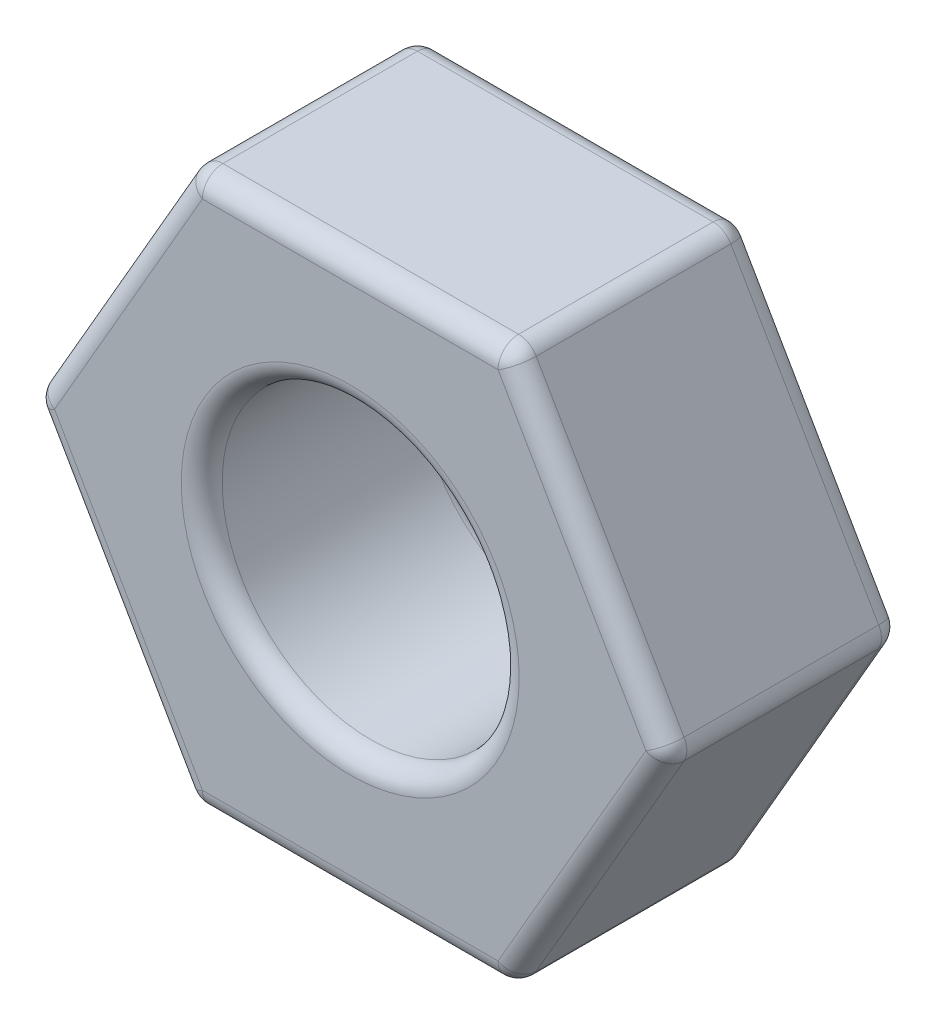
ISO-10303-21;
HEADER;
FILE_DESCRIPTION(('STEP AP214'),'2;1');
FILE_NAME('part.step','',(''),(''),'','','');
FILE_SCHEMA(('AUTOMOTIVE_DESIGN { 1 0 10303 214 1 1 1 1 }'));
ENDSEC;
DATA;
#1=APPLICATION_CONTEXT('core data for automotive mechanical design processes');
#2=APPLICATION_PROTOCOL_DEFINITION('international standard','automotive_design',2000,#1);
#3=PRODUCT_CONTEXT('',#1,'mechanical');
#4=PRODUCT('Part','Part','',(#3));
#5=PRODUCT_RELATED_PRODUCT_CATEGORY('part','',(#4));
#6=PRODUCT_DEFINITION_FORMATION('','',#4);
#7=PRODUCT_DEFINITION_CONTEXT('part definition',#1,'design');
#8=PRODUCT_DEFINITION('design','',#6,#7);
#9=PRODUCT_DEFINITION_SHAPE('','',#8);
#10=(LENGTH_UNIT() NAMED_UNIT(*) SI_UNIT(.MILLI.,.METRE.));
#11=(NAMED_UNIT(*) PLANE_ANGLE_UNIT() SI_UNIT($,.RADIAN.));
#12=(NAMED_UNIT(*) SI_UNIT($,.STERADIAN.) SOLID_ANGLE_UNIT());
#13=UNCERTAINTY_MEASURE_WITH_UNIT(LENGTH_MEASURE(1.E-05),#10,'distance_accuracy_value','');
#14=(GEOMETRIC_REPRESENTATION_CONTEXT(3) GLOBAL_UNCERTAINTY_ASSIGNED_CONTEXT((#13)) GLOBAL_UNIT_ASSIGNED_CONTEXT((#10,
#11,#12)) REPRESENTATION_CONTEXT('',''));
#15=CARTESIAN_POINT('',(0.,0.,0.));
#16=DIRECTION('',(0.,0.,1.));
#17=DIRECTION('',(1.,0.,0.));
#18=AXIS2_PLACEMENT_3D('',#15,#16,#17);
#19=CARTESIAN_POINT('',(0.,0.,2.3));
#20=DIRECTION('',(0.,0.,1.));
#21=DIRECTION('',(1.,0.,0.));
#22=AXIS2_PLACEMENT_3D('',#19,#20,#21);
#23=PLANE('',#22);
#24=CARTESIAN_POINT('',(0.,0.,2.3));
#25=DIRECTION('',(0.,0.,1.));
#26=DIRECTION('',(1.,0.,0.));
#27=AXIS2_PLACEMENT_3D('',#24,#25,#26);
#28=CIRCLE('',#27,1.65);
#29=CARTESIAN_POINT('',(1.65,0.,2.3));
#30=VERTEX_POINT('',#29);
#31=EDGE_CURVE('E11',#30,#30,#28,.F.);
#32=ORIENTED_EDGE('',*,*,#31,.T.);
#33=EDGE_LOOP('',(#32));
#34=FACE_BOUND('',#33,.T.);
#35=DIRECTION('',(-0.5,0.866025403784439,0.));
#36=VECTOR('',#35,1.);
#37=CARTESIAN_POINT('',(1.3856406460551,2.6,2.3));
#38=LINE('',#37,#36);
#39=CARTESIAN_POINT('',(2.88675134594813,0.,2.3));
#40=VERTEX_POINT('',#39);
#41=CARTESIAN_POINT('',(1.44337567297406,2.5,2.3));
#42=VERTEX_POINT('',#41);
#43=EDGE_CURVE('E60',#40,#42,#38,.T.);
#44=ORIENTED_EDGE('',*,*,#43,.T.);
#45=DIRECTION('',(-1.,0.,0.));
#46=VECTOR('',#45,1.);
#47=CARTESIAN_POINT('',(-1.55884572681199,2.5,2.3));
#48=LINE('',#47,#46);
#49=CARTESIAN_POINT('',(-1.44337567297406,2.5,2.3));
#50=VERTEX_POINT('',#49);
#51=EDGE_CURVE('E52',#42,#50,#48,.T.);
#52=ORIENTED_EDGE('',*,*,#51,.T.);
#53=DIRECTION('',(-0.5,-0.866025403784439,0.));
#54=VECTOR('',#53,1.);
#55=CARTESIAN_POINT('',(-2.94448637286709,-0.0999999999999998,2.3));
#56=LINE('',#55,#54);
#57=CARTESIAN_POINT('',(-2.88675134594813,0.,2.3));
#58=VERTEX_POINT('',#57);
#59=EDGE_CURVE('E278',#50,#58,#56,.T.);
#60=ORIENTED_EDGE('',*,*,#59,.T.);
#61=DIRECTION('',(0.5,-0.866025403784439,0.));
#62=VECTOR('',#61,1.);
#63=CARTESIAN_POINT('',(-1.3856406460551,-2.6,2.3));
#64=LINE('',#63,#62);
#65=CARTESIAN_POINT('',(-1.44337567297407,-2.5,2.3));
#66=VERTEX_POINT('',#65);
#67=EDGE_CURVE('E280',#58,#66,#64,.T.);
#68=ORIENTED_EDGE('',*,*,#67,.T.);
#69=DIRECTION('',(1.,0.,0.));
#70=VECTOR('',#69,1.);
#71=CARTESIAN_POINT('',(1.55884572681199,-2.5,2.3));
#72=LINE('',#71,#70);
#73=CARTESIAN_POINT('',(1.44337567297406,-2.5,2.3));
#74=VERTEX_POINT('',#73);
#75=EDGE_CURVE('E282',#66,#74,#72,.T.);
#76=ORIENTED_EDGE('',*,*,#75,.T.);
#77=DIRECTION('',(0.5,0.866025403784439,0.));
#78=VECTOR('',#77,1.);
#79=CARTESIAN_POINT('',(2.94448637286709,0.1,2.3));
#80=LINE('',#79,#78);
#81=EDGE_CURVE('E65',#74,#40,#80,.T.);
#82=ORIENTED_EDGE('',*,*,#81,.T.);
#83=EDGE_LOOP('',(#44,#52,#60,#68,#76,#82));
#84=FACE_BOUND('',#83,.T.);
#85=ADVANCED_FACE('F43',(#34,#84),#23,.T.);
#86=CARTESIAN_POINT('',(0.,0.,0.));
#87=DIRECTION('',(0.,0.,1.));
#88=DIRECTION('',(1.,0.,0.));
#89=AXIS2_PLACEMENT_3D('',#86,#87,#88);
#90=PLANE('',#89);
#91=CARTESIAN_POINT('',(0.,0.,0.));
#92=DIRECTION('',(0.,0.,1.));
#93=DIRECTION('',(1.,0.,0.));
#94=AXIS2_PLACEMENT_3D('',#91,#92,#93);
#95=CIRCLE('',#94,1.65);
#96=CARTESIAN_POINT('',(1.65,0.,0.));
#97=VERTEX_POINT('',#96);
#98=EDGE_CURVE('E269',#97,#97,#95,.T.);
#99=ORIENTED_EDGE('',*,*,#98,.T.);
#100=EDGE_LOOP('',(#99));
#101=FACE_BOUND('',#100,.T.);
#102=DIRECTION('',(1.,0.,0.));
#103=VECTOR('',#102,1.);
#104=CARTESIAN_POINT('',(0.,-2.5,0.));
#105=LINE('',#104,#103);
#106=CARTESIAN_POINT('',(1.44337567297406,-2.5,0.));
#107=VERTEX_POINT('',#106);
#108=CARTESIAN_POINT('',(-1.44337567297407,-2.5,0.));
#109=VERTEX_POINT('',#108);
#110=EDGE_CURVE('E264',#107,#109,#105,.F.);
#111=ORIENTED_EDGE('',*,*,#110,.T.);
#112=DIRECTION('',(0.5,-0.866025403784439,0.));
#113=VECTOR('',#112,1.);
#114=CARTESIAN_POINT('',(-2.1650635094611,-1.25,0.));
#115=LINE('',#114,#113);
#116=CARTESIAN_POINT('',(-2.88675134594813,0.,0.));
#117=VERTEX_POINT('',#116);
#118=EDGE_CURVE('E266',#109,#117,#115,.F.);
#119=ORIENTED_EDGE('',*,*,#118,.T.);
#120=DIRECTION('',(-0.5,-0.866025403784439,0.));
#121=VECTOR('',#120,1.);
#122=CARTESIAN_POINT('',(-2.1650635094611,1.25,0.));
#123=LINE('',#122,#121);
#124=CARTESIAN_POINT('',(-1.44337567297406,2.5,0.));
#125=VERTEX_POINT('',#124);
#126=EDGE_CURVE('E256',#117,#125,#123,.F.);
#127=ORIENTED_EDGE('',*,*,#126,.T.);
#128=DIRECTION('',(-1.,0.,0.));
#129=VECTOR('',#128,1.);
#130=CARTESIAN_POINT('',(0.,2.5,0.));
#131=LINE('',#130,#129);
#132=CARTESIAN_POINT('',(1.44337567297406,2.5,0.));
#133=VERTEX_POINT('',#132);
#134=EDGE_CURVE('E258',#125,#133,#131,.F.);
#135=ORIENTED_EDGE('',*,*,#134,.T.);
#136=DIRECTION('',(-0.5,0.866025403784439,0.));
#137=VECTOR('',#136,1.);
#138=CARTESIAN_POINT('',(2.1650635094611,1.25,0.));
#139=LINE('',#138,#137);
#140=CARTESIAN_POINT('',(2.88675134594813,0.,0.));
#141=VERTEX_POINT('',#140);
#142=EDGE_CURVE('E260',#133,#141,#139,.F.);
#143=ORIENTED_EDGE('',*,*,#142,.T.);
#144=DIRECTION('',(0.5,0.866025403784439,0.));
#145=VECTOR('',#144,1.);
#146=CARTESIAN_POINT('',(2.1650635094611,-1.25,0.));
#147=LINE('',#146,#145);
#148=EDGE_CURVE('E262',#141,#107,#147,.F.);
#149=ORIENTED_EDGE('',*,*,#148,.T.);
#150=EDGE_LOOP('',(#111,#119,#127,#135,#143,#149));
#151=FACE_BOUND('',#150,.T.);
#152=ADVANCED_FACE('F386',(#101,#151),#90,.F.);
#153=CARTESIAN_POINT('',(-1.55884572681199,2.7,2.3));
#154=DIRECTION('',(0.866025403784439,-0.5,0.));
#155=DIRECTION('',(0.5,0.866025403784439,0.));
#156=AXIS2_PLACEMENT_3D('',#153,#154,#155);
#157=PLANE('',#156);
#158=DIRECTION('',(0.,0.,-1.));
#159=VECTOR('',#158,1.);
#160=CARTESIAN_POINT('',(-1.61658075373095,2.6,2.3));
#161=LINE('',#160,#159);
#162=CARTESIAN_POINT('',(-1.61658075373095,2.6,2.1));
#163=VERTEX_POINT('',#162);
#164=CARTESIAN_POINT('',(-1.61658075373095,2.6,0.2));
#165=VERTEX_POINT('',#164);
#166=EDGE_CURVE('E226',#163,#165,#161,.T.);
#167=ORIENTED_EDGE('',*,*,#166,.T.);
#168=DIRECTION('',(-0.5,-0.866025403784439,0.));
#169=VECTOR('',#168,1.);
#170=CARTESIAN_POINT('',(-1.55884572681199,2.7,0.2));
#171=LINE('',#170,#169);
#172=CARTESIAN_POINT('',(-3.05995642670502,0.1,0.2));
#173=VERTEX_POINT('',#172);
#174=EDGE_CURVE('E229',#165,#173,#171,.T.);
#175=ORIENTED_EDGE('',*,*,#174,.T.);
#176=DIRECTION('',(0.,0.,-1.));
#177=VECTOR('',#176,1.);
#178=CARTESIAN_POINT('',(-3.05995642670502,0.1,2.3));
#179=LINE('',#178,#177);
#180=CARTESIAN_POINT('',(-3.05995642670502,0.1,2.1));
#181=VERTEX_POINT('',#180);
#182=EDGE_CURVE('E224',#173,#181,#179,.F.);
#183=ORIENTED_EDGE('',*,*,#182,.T.);
#184=DIRECTION('',(-0.5,-0.866025403784439,0.));
#185=VECTOR('',#184,1.);
#186=CARTESIAN_POINT('',(-1.55884572681199,2.7,2.1));
#187=LINE('',#186,#185);
#188=EDGE_CURVE('E222',#181,#163,#187,.F.);
#189=ORIENTED_EDGE('',*,*,#188,.T.);
#190=EDGE_LOOP('',(#167,#175,#183,#189));
#191=FACE_BOUND('',#190,.T.);
#192=ADVANCED_FACE('F472',(#191),#157,.F.);
#193=CARTESIAN_POINT('',(-3.11769145362398,0.,2.3));
#194=DIRECTION('',(0.866025403784439,0.5,0.));
#195=DIRECTION('',(-0.5,0.866025403784439,0.));
#196=AXIS2_PLACEMENT_3D('',#193,#194,#195);
#197=PLANE('',#196);
#198=DIRECTION('',(0.,0.,-1.));
#199=VECTOR('',#198,1.);
#200=CARTESIAN_POINT('',(-3.05995642670502,-0.0999999999999998,2.3));
#201=LINE('',#200,#199);
#202=CARTESIAN_POINT('',(-3.05995642670502,-0.0999999999999997,2.1));
#203=VERTEX_POINT('',#202);
#204=CARTESIAN_POINT('',(-3.05995642670502,-0.0999999999999998,0.2));
#205=VERTEX_POINT('',#204);
#206=EDGE_CURVE('E215',#203,#205,#201,.T.);
#207=ORIENTED_EDGE('',*,*,#206,.T.);
#208=DIRECTION('',(0.5,-0.866025403784439,0.));
#209=VECTOR('',#208,1.);
#210=CARTESIAN_POINT('',(-3.11769145362398,0.,0.2));
#211=LINE('',#210,#209);
#212=CARTESIAN_POINT('',(-1.61658075373095,-2.6,0.2));
#213=VERTEX_POINT('',#212);
#214=EDGE_CURVE('E220',#205,#213,#211,.T.);
#215=ORIENTED_EDGE('',*,*,#214,.T.);
#216=DIRECTION('',(0.,0.,-1.));
#217=VECTOR('',#216,1.);
#218=CARTESIAN_POINT('',(-1.61658075373095,-2.6,2.3));
#219=LINE('',#218,#217);
#220=CARTESIAN_POINT('',(-1.61658075373095,-2.6,2.1));
#221=VERTEX_POINT('',#220);
#222=EDGE_CURVE('E217',#213,#221,#219,.F.);
#223=ORIENTED_EDGE('',*,*,#222,.T.);
#224=DIRECTION('',(0.5,-0.866025403784439,0.));
#225=VECTOR('',#224,1.);
#226=CARTESIAN_POINT('',(-3.11769145362398,0.,2.1));
#227=LINE('',#226,#225);
#228=EDGE_CURVE('E213',#221,#203,#227,.F.);
#229=ORIENTED_EDGE('',*,*,#228,.T.);
#230=EDGE_LOOP('',(#207,#215,#223,#229));
#231=FACE_BOUND('',#230,.T.);
#232=ADVANCED_FACE('F488',(#231),#197,.F.);
#233=CARTESIAN_POINT('',(-1.55884572681199,-2.7,2.3));
#234=DIRECTION('',(0.,1.,0.));
#235=DIRECTION('',(-1.,0.,0.));
#236=AXIS2_PLACEMENT_3D('',#233,#234,#235);
#237=PLANE('',#236);
#238=DIRECTION('',(0.,0.,-1.));
#239=VECTOR('',#238,1.);
#240=CARTESIAN_POINT('',(-1.44337567297407,-2.7,2.3));
#241=LINE('',#240,#239);
#242=CARTESIAN_POINT('',(-1.44337567297407,-2.7,2.1));
#243=VERTEX_POINT('',#242);
#244=CARTESIAN_POINT('',(-1.44337567297407,-2.7,0.2));
#245=VERTEX_POINT('',#244);
#246=EDGE_CURVE('E180',#243,#245,#241,.T.);
#247=ORIENTED_EDGE('',*,*,#246,.T.);
#248=DIRECTION('',(1.,0.,0.));
#249=VECTOR('',#248,1.);
#250=CARTESIAN_POINT('',(-1.55884572681199,-2.7,0.2));
#251=LINE('',#250,#249);
#252=CARTESIAN_POINT('',(1.44337567297406,-2.7,0.2));
#253=VERTEX_POINT('',#252);
#254=EDGE_CURVE('E176',#245,#253,#251,.T.);
#255=ORIENTED_EDGE('',*,*,#254,.T.);
#256=DIRECTION('',(0.,0.,-1.));
#257=VECTOR('',#256,1.);
#258=CARTESIAN_POINT('',(1.44337567297406,-2.7,2.3));
#259=LINE('',#258,#257);
#260=CARTESIAN_POINT('',(1.44337567297406,-2.7,2.1));
#261=VERTEX_POINT('',#260);
#262=EDGE_CURVE('E168',#253,#261,#259,.F.);
#263=ORIENTED_EDGE('',*,*,#262,.T.);
#264=DIRECTION('',(1.,0.,0.));
#265=VECTOR('',#264,1.);
#266=CARTESIAN_POINT('',(-1.55884572681199,-2.7,2.1));
#267=LINE('',#266,#265);
#268=EDGE_CURVE('E173',#261,#243,#267,.F.);
#269=ORIENTED_EDGE('',*,*,#268,.T.);
#270=EDGE_LOOP('',(#247,#255,#263,#269));
#271=FACE_BOUND('',#270,.T.);
#272=ADVANCED_FACE('F171',(#271),#237,.F.);
#273=CARTESIAN_POINT('',(1.55884572681199,-2.7,2.3));
#274=DIRECTION('',(-0.866025403784439,0.5,0.));
#275=DIRECTION('',(-0.5,-0.866025403784439,0.));
#276=AXIS2_PLACEMENT_3D('',#273,#274,#275);
#277=PLANE('',#276);
#278=DIRECTION('',(0.,0.,-1.));
#279=VECTOR('',#278,1.);
#280=CARTESIAN_POINT('',(1.61658075373095,-2.6,2.3));
#281=LINE('',#280,#279);
#282=CARTESIAN_POINT('',(1.61658075373095,-2.6,2.1));
#283=VERTEX_POINT('',#282);
#284=CARTESIAN_POINT('',(1.61658075373095,-2.6,0.2));
#285=VERTEX_POINT('',#284);
#286=EDGE_CURVE('E188',#283,#285,#281,.T.);
#287=ORIENTED_EDGE('',*,*,#286,.T.);
#288=DIRECTION('',(0.5,0.866025403784439,0.));
#289=VECTOR('',#288,1.);
#290=CARTESIAN_POINT('',(1.55884572681199,-2.7,0.2));
#291=LINE('',#290,#289);
#292=CARTESIAN_POINT('',(3.05995642670502,-0.1,0.2));
#293=VERTEX_POINT('',#292);
#294=EDGE_CURVE('E254',#285,#293,#291,.T.);
#295=ORIENTED_EDGE('',*,*,#294,.T.);
#296=DIRECTION('',(0.,0.,-1.));
#297=VECTOR('',#296,1.);
#298=CARTESIAN_POINT('',(3.05995642670502,-0.0999999999999994,2.3));
#299=LINE('',#298,#297);
#300=CARTESIAN_POINT('',(3.05995642670502,-0.1,2.1));
#301=VERTEX_POINT('',#300);
#302=EDGE_CURVE('E251',#293,#301,#299,.F.);
#303=ORIENTED_EDGE('',*,*,#302,.T.);
#304=DIRECTION('',(0.5,0.866025403784439,0.));
#305=VECTOR('',#304,1.);
#306=CARTESIAN_POINT('',(1.55884572681199,-2.7,2.1));
#307=LINE('',#306,#305);
#308=EDGE_CURVE('E249',#301,#283,#307,.F.);
#309=ORIENTED_EDGE('',*,*,#308,.T.);
#310=EDGE_LOOP('',(#287,#295,#303,#309));
#311=FACE_BOUND('',#310,.T.);
#312=ADVANCED_FACE('F482',(#311),#277,.F.);
#313=CARTESIAN_POINT('',(3.11769145362398,0.,2.3));
#314=DIRECTION('',(-0.866025403784439,-0.5,0.));
#315=DIRECTION('',(0.5,-0.866025403784439,0.));
#316=AXIS2_PLACEMENT_3D('',#313,#314,#315);
#317=PLANE('',#316);
#318=DIRECTION('',(0.,0.,-1.));
#319=VECTOR('',#318,1.);
#320=CARTESIAN_POINT('',(3.05995642670502,0.0999999999999998,2.3));
#321=LINE('',#320,#319);
#322=CARTESIAN_POINT('',(3.05995642670502,0.0999999999999998,2.1));
#323=VERTEX_POINT('',#322);
#324=CARTESIAN_POINT('',(3.05995642670502,0.0999999999999998,0.2));
#325=VERTEX_POINT('',#324);
#326=EDGE_CURVE('E242',#323,#325,#321,.T.);
#327=ORIENTED_EDGE('',*,*,#326,.T.);
#328=DIRECTION('',(-0.5,0.866025403784439,0.));
#329=VECTOR('',#328,1.);
#330=CARTESIAN_POINT('',(3.11769145362398,0.,0.2));
#331=LINE('',#330,#329);
#332=CARTESIAN_POINT('',(1.61658075373095,2.6,0.2));
#333=VERTEX_POINT('',#332);
#334=EDGE_CURVE('E247',#325,#333,#331,.T.);
#335=ORIENTED_EDGE('',*,*,#334,.T.);
#336=DIRECTION('',(0.,0.,-1.));
#337=VECTOR('',#336,1.);
#338=CARTESIAN_POINT('',(1.61658075373095,2.6,2.3));
#339=LINE('',#338,#337);
#340=CARTESIAN_POINT('',(1.61658075373095,2.6,2.1));
#341=VERTEX_POINT('',#340);
#342=EDGE_CURVE('E244',#333,#341,#339,.F.);
#343=ORIENTED_EDGE('',*,*,#342,.T.);
#344=DIRECTION('',(-0.5,0.866025403784439,0.));
#345=VECTOR('',#344,1.);
#346=CARTESIAN_POINT('',(3.11769145362398,0.,2.1));
#347=LINE('',#346,#345);
#348=EDGE_CURVE('E240',#341,#323,#347,.F.);
#349=ORIENTED_EDGE('',*,*,#348,.T.);
#350=EDGE_LOOP('',(#327,#335,#343,#349));
#351=FACE_BOUND('',#350,.T.);
#352=ADVANCED_FACE('F420',(#351),#317,.F.);
#353=CARTESIAN_POINT('',(1.55884572681199,2.7,2.3));
#354=DIRECTION('',(0.,-1.,0.));
#355=DIRECTION('',(0.,0.,-1.));
#356=AXIS2_PLACEMENT_3D('',#353,#354,#355);
#357=PLANE('',#356);
#358=DIRECTION('',(0.,0.,-1.));
#359=VECTOR('',#358,1.);
#360=CARTESIAN_POINT('',(1.44337567297406,2.7,2.3));
#361=LINE('',#360,#359);
#362=CARTESIAN_POINT('',(1.44337567297406,2.7,2.1));
#363=VERTEX_POINT('',#362);
#364=CARTESIAN_POINT('',(1.44337567297406,2.7,0.2));
#365=VERTEX_POINT('',#364);
#366=EDGE_CURVE('E233',#363,#365,#361,.T.);
#367=ORIENTED_EDGE('',*,*,#366,.T.);
#368=DIRECTION('',(-1.,0.,0.));
#369=VECTOR('',#368,1.);
#370=CARTESIAN_POINT('',(1.55884572681199,2.7,0.2));
#371=LINE('',#370,#369);
#372=CARTESIAN_POINT('',(-1.44337567297406,2.7,0.2));
#373=VERTEX_POINT('',#372);
#374=EDGE_CURVE('E238',#365,#373,#371,.T.);
#375=ORIENTED_EDGE('',*,*,#374,.T.);
#376=DIRECTION('',(0.,0.,-1.));
#377=VECTOR('',#376,1.);
#378=CARTESIAN_POINT('',(-1.44337567297406,2.7,2.3));
#379=LINE('',#378,#377);
#380=CARTESIAN_POINT('',(-1.44337567297406,2.7,2.1));
#381=VERTEX_POINT('',#380);
#382=EDGE_CURVE('E235',#373,#381,#379,.F.);
#383=ORIENTED_EDGE('',*,*,#382,.T.);
#384=DIRECTION('',(-1.,0.,0.));
#385=VECTOR('',#384,1.);
#386=CARTESIAN_POINT('',(1.55884572681199,2.7,2.1));
#387=LINE('',#386,#385);
#388=EDGE_CURVE('E231',#381,#363,#387,.F.);
#389=ORIENTED_EDGE('',*,*,#388,.T.);
#390=EDGE_LOOP('',(#367,#375,#383,#389));
#391=FACE_BOUND('',#390,.T.);
#392=ADVANCED_FACE('F396',(#391),#357,.F.);
#393=CARTESIAN_POINT('',(0.,0.,2.3));
#394=DIRECTION('',(0.,0.,-1.));
#395=DIRECTION('',(-1.,0.,0.));
#396=AXIS2_PLACEMENT_3D('',#393,#394,#395);
#397=CYLINDRICAL_SURFACE('',#396,1.45);
#398=CARTESIAN_POINT('',(0.,0.,0.2));
#399=DIRECTION('',(0.,0.,1.));
#400=DIRECTION('',(1.,0.,0.));
#401=AXIS2_PLACEMENT_3D('',#398,#399,#400);
#402=CIRCLE('',#401,1.45);
#403=CARTESIAN_POINT('',(1.45,0.,0.2));
#404=VERTEX_POINT('',#403);
#405=EDGE_CURVE('E275',#404,#404,#402,.F.);
#406=ORIENTED_EDGE('',*,*,#405,.T.);
#407=EDGE_LOOP('',(#406));
#408=FACE_BOUND('',#407,.T.);
#409=CARTESIAN_POINT('',(0.,0.,2.1));
#410=DIRECTION('',(0.,0.,1.));
#411=DIRECTION('',(1.,0.,0.));
#412=AXIS2_PLACEMENT_3D('',#409,#410,#411);
#413=CIRCLE('',#412,1.45);
#414=CARTESIAN_POINT('',(1.45,0.,2.1));
#415=VERTEX_POINT('',#414);
#416=EDGE_CURVE('E272',#415,#415,#413,.T.);
#417=ORIENTED_EDGE('',*,*,#416,.T.);
#418=EDGE_LOOP('',(#417));
#419=FACE_BOUND('',#418,.T.);
#420=ADVANCED_FACE('F476',(#408,#419),#397,.F.);
#421=CARTESIAN_POINT('',(1.44337567297406,2.5,2.3));
#422=DIRECTION('',(0.,0.,-1.));
#423=DIRECTION('',(-1.,0.,0.));
#424=AXIS2_PLACEMENT_3D('',#421,#422,#423);
#425=CYLINDRICAL_SURFACE('',#424,0.2);
#426=CARTESIAN_POINT('',(1.44337567297406,2.5,2.1));
#427=DIRECTION('',(0.,0.,1.));
#428=DIRECTION('',(1.,0.,0.));
#429=AXIS2_PLACEMENT_3D('',#426,#427,#428);
#430=CIRCLE('',#429,0.2);
#431=EDGE_CURVE('E47',#341,#363,#430,.T.);
#432=ORIENTED_EDGE('',*,*,#431,.F.);
#433=ORIENTED_EDGE('',*,*,#342,.F.);
#434=CARTESIAN_POINT('',(1.44337567297406,2.5,0.2));
#435=DIRECTION('',(0.,0.,-1.));
#436=DIRECTION('',(-1.,0.,0.));
#437=AXIS2_PLACEMENT_3D('',#434,#435,#436);
#438=CIRCLE('',#437,0.2);
#439=EDGE_CURVE('E209',#365,#333,#438,.T.);
#440=ORIENTED_EDGE('',*,*,#439,.F.);
#441=ORIENTED_EDGE('',*,*,#366,.F.);
#442=EDGE_LOOP('',(#432,#433,#440,#441));
#443=FACE_BOUND('',#442,.T.);
#444=ADVANCED_FACE('F411',(#443),#425,.T.);
#445=CARTESIAN_POINT('',(1.44337567297406,2.5,2.1));
#446=DIRECTION('',(0.,0.,1.));
#447=DIRECTION('',(1.,0.,0.));
#448=AXIS2_PLACEMENT_3D('',#445,#446,#447);
#449=SPHERICAL_SURFACE('',#448,0.2);
#450=CARTESIAN_POINT('',(1.44337567297406,2.5,2.1));
#451=DIRECTION('',(-0.499999999999999,0.866025403784439,0.));
#452=DIRECTION('',(-0.866025403784439,-0.499999999999999,0.));
#453=AXIS2_PLACEMENT_3D('',#450,#451,#452);
#454=CIRCLE('',#453,0.2);
#455=EDGE_CURVE('E364',#341,#42,#454,.F.);
#456=ORIENTED_EDGE('',*,*,#455,.F.);
#457=ORIENTED_EDGE('',*,*,#431,.T.);
#458=CARTESIAN_POINT('',(1.44337567297406,2.5,2.1));
#459=DIRECTION('',(1.,0.,0.));
#460=DIRECTION('',(0.,0.,-1.));
#461=AXIS2_PLACEMENT_3D('',#458,#459,#460);
#462=CIRCLE('',#461,0.2);
#463=EDGE_CURVE('E366',#42,#363,#462,.F.);
#464=ORIENTED_EDGE('',*,*,#463,.F.);
#465=EDGE_LOOP('',(#456,#457,#464));
#466=FACE_BOUND('',#465,.T.);
#467=ADVANCED_FACE('F414',(#466),#449,.T.);
#468=CARTESIAN_POINT('',(1.44337567297406,2.5,0.2));
#469=DIRECTION('',(0.,0.,-1.));
#470=DIRECTION('',(-1.,0.,0.));
#471=AXIS2_PLACEMENT_3D('',#468,#469,#470);
#472=SPHERICAL_SURFACE('',#471,0.2);
#473=CARTESIAN_POINT('',(1.44337567297406,2.5,0.2));
#474=DIRECTION('',(1.,0.,0.));
#475=DIRECTION('',(0.,1.,0.));
#476=AXIS2_PLACEMENT_3D('',#473,#474,#475);
#477=CIRCLE('',#476,0.2);
#478=EDGE_CURVE('E358',#365,#133,#477,.F.);
#479=ORIENTED_EDGE('',*,*,#478,.F.);
#480=ORIENTED_EDGE('',*,*,#439,.T.);
#481=CARTESIAN_POINT('',(1.44337567297406,2.5,0.2));
#482=DIRECTION('',(-0.499999999999999,0.866025403784439,0.));
#483=DIRECTION('',(-0.866025403784439,-0.499999999999999,0.));
#484=AXIS2_PLACEMENT_3D('',#481,#482,#483);
#485=CIRCLE('',#484,0.2);
#486=EDGE_CURVE('E361',#133,#333,#485,.F.);
#487=ORIENTED_EDGE('',*,*,#486,.F.);
#488=EDGE_LOOP('',(#479,#480,#487));
#489=FACE_BOUND('',#488,.T.);
#490=ADVANCED_FACE('F373',(#489),#472,.T.);
#491=CARTESIAN_POINT('',(0.,2.5,2.1));
#492=DIRECTION('',(1.,0.,0.));
#493=DIRECTION('',(0.,0.,-1.));
#494=AXIS2_PLACEMENT_3D('',#491,#492,#493);
#495=CYLINDRICAL_SURFACE('',#494,0.2);
#496=ORIENTED_EDGE('',*,*,#463,.T.);
#497=ORIENTED_EDGE('',*,*,#388,.F.);
#498=CARTESIAN_POINT('',(-1.44337567297406,2.5,2.1));
#499=DIRECTION('',(-1.,0.,0.));
#500=DIRECTION('',(0.,-1.,0.));
#501=AXIS2_PLACEMENT_3D('',#498,#499,#500);
#502=CIRCLE('',#501,0.2);
#503=EDGE_CURVE('E353',#50,#381,#502,.T.);
#504=ORIENTED_EDGE('',*,*,#503,.F.);
#505=ORIENTED_EDGE('',*,*,#51,.F.);
#506=EDGE_LOOP('',(#496,#497,#504,#505));
#507=FACE_BOUND('',#506,.T.);
#508=ADVANCED_FACE('F407',(#507),#495,.T.);
#509=CARTESIAN_POINT('',(2.1650635094611,1.25,2.1));
#510=DIRECTION('',(0.5,-0.866025403784439,0.));
#511=DIRECTION('',(0.866025403784439,0.5,0.));
#512=AXIS2_PLACEMENT_3D('',#509,#510,#511);
#513=CYLINDRICAL_SURFACE('',#512,0.2);
#514=ORIENTED_EDGE('',*,*,#455,.T.);
#515=ORIENTED_EDGE('',*,*,#43,.F.);
#516=CARTESIAN_POINT('',(2.88675134594813,0.,2.1));
#517=DIRECTION('',(0.5,-0.866025403784439,0.));
#518=DIRECTION('',(0.866025403784439,0.5,0.));
#519=AXIS2_PLACEMENT_3D('',#516,#517,#518);
#520=CIRCLE('',#519,0.2);
#521=EDGE_CURVE('E350',#323,#40,#520,.T.);
#522=ORIENTED_EDGE('',*,*,#521,.F.);
#523=ORIENTED_EDGE('',*,*,#348,.F.);
#524=EDGE_LOOP('',(#514,#515,#522,#523));
#525=FACE_BOUND('',#524,.T.);
#526=ADVANCED_FACE('F416',(#525),#513,.T.);
#527=CARTESIAN_POINT('',(2.88675134594813,0.,2.3));
#528=DIRECTION('',(0.,0.,-1.));
#529=DIRECTION('',(-1.,0.,0.));
#530=AXIS2_PLACEMENT_3D('',#527,#528,#529);
#531=CYLINDRICAL_SURFACE('',#530,0.2);
#532=CARTESIAN_POINT('',(2.88675134594813,0.,0.2));
#533=DIRECTION('',(0.,0.,-1.));
#534=DIRECTION('',(-1.,0.,0.));
#535=AXIS2_PLACEMENT_3D('',#532,#533,#534);
#536=CIRCLE('',#535,0.2);
#537=EDGE_CURVE('E344',#325,#293,#536,.T.);
#538=ORIENTED_EDGE('',*,*,#537,.F.);
#539=ORIENTED_EDGE('',*,*,#326,.F.);
#540=CARTESIAN_POINT('',(2.88675134594813,0.,2.1));
#541=DIRECTION('',(0.,0.,1.));
#542=DIRECTION('',(1.,0.,0.));
#543=AXIS2_PLACEMENT_3D('',#540,#541,#542);
#544=CIRCLE('',#543,0.2);
#545=EDGE_CURVE('E347',#301,#323,#544,.T.);
#546=ORIENTED_EDGE('',*,*,#545,.F.);
#547=ORIENTED_EDGE('',*,*,#302,.F.);
#548=EDGE_LOOP('',(#538,#539,#546,#547));
#549=FACE_BOUND('',#548,.T.);
#550=ADVANCED_FACE('F423',(#549),#531,.T.);
#551=CARTESIAN_POINT('',(2.94448637286709,-0.1,0.2));
#552=DIRECTION('',(-0.5,0.866025403784439,0.));
#553=DIRECTION('',(-0.866025403784439,-0.5,0.));
#554=AXIS2_PLACEMENT_3D('',#551,#552,#553);
#555=CYLINDRICAL_SURFACE('',#554,0.2);
#556=ORIENTED_EDGE('',*,*,#486,.T.);
#557=ORIENTED_EDGE('',*,*,#334,.F.);
#558=CARTESIAN_POINT('',(2.88675134594813,0.,0.2));
#559=DIRECTION('',(0.499999999999999,-0.866025403784439,0.));
#560=DIRECTION('',(0.866025403784439,0.499999999999999,0.));
#561=AXIS2_PLACEMENT_3D('',#558,#559,#560);
#562=CIRCLE('',#561,0.2);
#563=EDGE_CURVE('E341',#141,#325,#562,.T.);
#564=ORIENTED_EDGE('',*,*,#563,.F.);
#565=ORIENTED_EDGE('',*,*,#142,.F.);
#566=EDGE_LOOP('',(#556,#557,#564,#565));
#567=FACE_BOUND('',#566,.T.);
#568=ADVANCED_FACE('F381',(#567),#555,.T.);
#569=CARTESIAN_POINT('',(1.55884572681199,2.5,0.2));
#570=DIRECTION('',(-1.,0.,0.));
#571=DIRECTION('',(0.,0.,1.));
#572=AXIS2_PLACEMENT_3D('',#569,#570,#571);
#573=CYLINDRICAL_SURFACE('',#572,0.2);
#574=ORIENTED_EDGE('',*,*,#478,.T.);
#575=ORIENTED_EDGE('',*,*,#134,.F.);
#576=CARTESIAN_POINT('',(-1.44337567297406,2.5,0.2));
#577=DIRECTION('',(-1.,0.,0.));
#578=DIRECTION('',(0.,0.,1.));
#579=AXIS2_PLACEMENT_3D('',#576,#577,#578);
#580=CIRCLE('',#579,0.2);
#581=EDGE_CURVE('E338',#373,#125,#580,.T.);
#582=ORIENTED_EDGE('',*,*,#581,.F.);
#583=ORIENTED_EDGE('',*,*,#374,.F.);
#584=EDGE_LOOP('',(#574,#575,#582,#583));
#585=FACE_BOUND('',#584,.T.);
#586=ADVANCED_FACE('F393',(#585),#573,.T.);
#587=CARTESIAN_POINT('',(-1.44337567297406,2.5,2.3));
#588=DIRECTION('',(0.,0.,-1.));
#589=DIRECTION('',(-1.,0.,0.));
#590=AXIS2_PLACEMENT_3D('',#587,#588,#589);
#591=CYLINDRICAL_SURFACE('',#590,0.2);
#592=CARTESIAN_POINT('',(-1.44337567297406,2.5,2.1));
#593=DIRECTION('',(0.,0.,1.));
#594=DIRECTION('',(1.,0.,0.));
#595=AXIS2_PLACEMENT_3D('',#592,#593,#594);
#596=CIRCLE('',#595,0.2);
#597=EDGE_CURVE('E355',#381,#163,#596,.T.);
#598=ORIENTED_EDGE('',*,*,#597,.F.);
#599=ORIENTED_EDGE('',*,*,#382,.F.);
#600=CARTESIAN_POINT('',(-1.44337567297406,2.5,0.2));
#601=DIRECTION('',(0.,0.,-1.));
#602=DIRECTION('',(-1.,0.,0.));
#603=AXIS2_PLACEMENT_3D('',#600,#601,#602);
#604=CIRCLE('',#603,0.2);
#605=EDGE_CURVE('E335',#165,#373,#604,.T.);
#606=ORIENTED_EDGE('',*,*,#605,.F.);
#607=ORIENTED_EDGE('',*,*,#166,.F.);
#608=EDGE_LOOP('',(#598,#599,#606,#607));
#609=FACE_BOUND('',#608,.T.);
#610=ADVANCED_FACE('F400',(#609),#591,.T.);
#611=CARTESIAN_POINT('',(-1.44337567297406,2.5,2.1));
#612=DIRECTION('',(0.,0.,1.));
#613=DIRECTION('',(1.,0.,0.));
#614=AXIS2_PLACEMENT_3D('',#611,#612,#613);
#615=SPHERICAL_SURFACE('',#614,0.2);
#616=ORIENTED_EDGE('',*,*,#503,.T.);
#617=ORIENTED_EDGE('',*,*,#597,.T.);
#618=CARTESIAN_POINT('',(-1.44337567297406,2.5,2.1));
#619=DIRECTION('',(0.499999999999999,0.866025403784439,0.));
#620=DIRECTION('',(-0.866025403784439,0.499999999999999,0.));
#621=AXIS2_PLACEMENT_3D('',#618,#619,#620);
#622=CIRCLE('',#621,0.2);
#623=EDGE_CURVE('E332',#50,#163,#622,.F.);
#624=ORIENTED_EDGE('',*,*,#623,.F.);
#625=EDGE_LOOP('',(#616,#617,#624));
#626=FACE_BOUND('',#625,.T.);
#627=ADVANCED_FACE('F545',(#626),#615,.T.);
#628=CARTESIAN_POINT('',(2.88675134594813,0.,2.1));
#629=DIRECTION('',(0.,0.,1.));
#630=DIRECTION('',(0.,-1.,0.));
#631=AXIS2_PLACEMENT_3D('',#628,#629,#630);
#632=SPHERICAL_SURFACE('',#631,0.2);
#633=ORIENTED_EDGE('',*,*,#545,.T.);
#634=ORIENTED_EDGE('',*,*,#521,.T.);
#635=CARTESIAN_POINT('',(2.88675134594813,0.,2.1));
#636=DIRECTION('',(0.499999999999999,0.866025403784439,0.));
#637=DIRECTION('',(-0.866025403784439,0.499999999999999,0.));
#638=AXIS2_PLACEMENT_3D('',#635,#636,#637);
#639=CIRCLE('',#638,0.2);
#640=EDGE_CURVE('E329',#301,#40,#639,.F.);
#641=ORIENTED_EDGE('',*,*,#640,.F.);
#642=EDGE_LOOP('',(#633,#634,#641));
#643=FACE_BOUND('',#642,.T.);
#644=ADVANCED_FACE('F464',(#643),#632,.T.);
#645=CARTESIAN_POINT('',(2.88675134594813,0.,0.2));
#646=DIRECTION('',(0.,0.,-1.));
#647=DIRECTION('',(0.,1.,0.));
#648=AXIS2_PLACEMENT_3D('',#645,#646,#647);
#649=SPHERICAL_SURFACE('',#648,0.2);
#650=ORIENTED_EDGE('',*,*,#563,.T.);
#651=ORIENTED_EDGE('',*,*,#537,.T.);
#652=CARTESIAN_POINT('',(2.88675134594813,0.,0.2));
#653=DIRECTION('',(0.5,0.866025403784439,0.));
#654=DIRECTION('',(-0.866025403784439,0.5,0.));
#655=AXIS2_PLACEMENT_3D('',#652,#653,#654);
#656=CIRCLE('',#655,0.2);
#657=EDGE_CURVE('E326',#141,#293,#656,.F.);
#658=ORIENTED_EDGE('',*,*,#657,.F.);
#659=EDGE_LOOP('',(#650,#651,#658));
#660=FACE_BOUND('',#659,.T.);
#661=ADVANCED_FACE('F427',(#660),#649,.T.);
#662=CARTESIAN_POINT('',(-1.44337567297406,2.5,0.2));
#663=DIRECTION('',(0.,0.,-1.));
#664=DIRECTION('',(-1.,0.,0.));
#665=AXIS2_PLACEMENT_3D('',#662,#663,#664);
#666=SPHERICAL_SURFACE('',#665,0.2);
#667=ORIENTED_EDGE('',*,*,#605,.T.);
#668=ORIENTED_EDGE('',*,*,#581,.T.);
#669=CARTESIAN_POINT('',(-1.44337567297406,2.5,0.2));
#670=DIRECTION('',(0.499999999999999,0.866025403784439,0.));
#671=DIRECTION('',(-0.866025403784439,0.499999999999999,0.));
#672=AXIS2_PLACEMENT_3D('',#669,#670,#671);
#673=CIRCLE('',#672,0.2);
#674=EDGE_CURVE('E323',#165,#125,#673,.F.);
#675=ORIENTED_EDGE('',*,*,#674,.F.);
#676=EDGE_LOOP('',(#667,#668,#675));
#677=FACE_BOUND('',#676,.T.);
#678=ADVANCED_FACE('F453',(#677),#666,.T.);
#679=CARTESIAN_POINT('',(-2.1650635094611,1.25,2.1));
#680=DIRECTION('',(0.5,0.866025403784439,0.));
#681=DIRECTION('',(-0.866025403784439,0.5,0.));
#682=AXIS2_PLACEMENT_3D('',#679,#680,#681);
#683=CYLINDRICAL_SURFACE('',#682,0.2);
#684=ORIENTED_EDGE('',*,*,#623,.T.);
#685=ORIENTED_EDGE('',*,*,#188,.F.);
#686=CARTESIAN_POINT('',(-2.88675134594813,0.,2.1));
#687=DIRECTION('',(-0.499999999999997,-0.86602540378444,0.));
#688=DIRECTION('',(0.866025403784441,-0.499999999999997,0.));
#689=AXIS2_PLACEMENT_3D('',#686,#687,#688);
#690=CIRCLE('',#689,0.2);
#691=EDGE_CURVE('E317',#58,#181,#690,.T.);
#692=ORIENTED_EDGE('',*,*,#691,.F.);
#693=ORIENTED_EDGE('',*,*,#59,.F.);
#694=EDGE_LOOP('',(#684,#685,#692,#693));
#695=FACE_BOUND('',#694,.T.);
#696=ADVANCED_FACE('F455',(#695),#683,.T.);
#697=CARTESIAN_POINT('',(2.1650635094611,-1.25,2.1));
#698=DIRECTION('',(-0.5,-0.866025403784439,0.));
#699=DIRECTION('',(0.866025403784439,-0.5,0.));
#700=AXIS2_PLACEMENT_3D('',#697,#698,#699);
#701=CYLINDRICAL_SURFACE('',#700,0.2);
#702=ORIENTED_EDGE('',*,*,#640,.T.);
#703=ORIENTED_EDGE('',*,*,#81,.F.);
#704=CARTESIAN_POINT('',(1.44337567297406,-2.5,2.1));
#705=DIRECTION('',(-0.499999999999999,-0.866025403784439,0.));
#706=DIRECTION('',(0.866025403784439,-0.499999999999999,0.));
#707=AXIS2_PLACEMENT_3D('',#704,#705,#706);
#708=CIRCLE('',#707,0.2);
#709=EDGE_CURVE('E192',#283,#74,#708,.T.);
#710=ORIENTED_EDGE('',*,*,#709,.F.);
#711=ORIENTED_EDGE('',*,*,#308,.F.);
#712=EDGE_LOOP('',(#702,#703,#710,#711));
#713=FACE_BOUND('',#712,.T.);
#714=ADVANCED_FACE('F461',(#713),#701,.T.);
#715=CARTESIAN_POINT('',(1.44337567297406,-2.5,2.3));
#716=DIRECTION('',(0.,0.,-1.));
#717=DIRECTION('',(-1.,0.,0.));
#718=AXIS2_PLACEMENT_3D('',#715,#716,#717);
#719=CYLINDRICAL_SURFACE('',#718,0.2);
#720=CARTESIAN_POINT('',(1.44337567297406,-2.5,0.2));
#721=DIRECTION('',(0.,0.,-1.));
#722=DIRECTION('',(-1.,0.,0.));
#723=AXIS2_PLACEMENT_3D('',#720,#721,#722);
#724=CIRCLE('',#723,0.2);
#725=EDGE_CURVE('E193',#285,#253,#724,.T.);
#726=ORIENTED_EDGE('',*,*,#725,.F.);
#727=ORIENTED_EDGE('',*,*,#286,.F.);
#728=CARTESIAN_POINT('',(1.44337567297406,-2.5,2.1));
#729=DIRECTION('',(0.,0.,1.));
#730=DIRECTION('',(1.,0.,0.));
#731=AXIS2_PLACEMENT_3D('',#728,#729,#730);
#732=CIRCLE('',#731,0.2);
#733=EDGE_CURVE('E184',#261,#283,#732,.T.);
#734=ORIENTED_EDGE('',*,*,#733,.F.);
#735=ORIENTED_EDGE('',*,*,#262,.F.);
#736=EDGE_LOOP('',(#726,#727,#734,#735));
#737=FACE_BOUND('',#736,.T.);
#738=ADVANCED_FACE('F186',(#737),#719,.T.);
#739=CARTESIAN_POINT('',(1.3856406460551,-2.6,0.2));
#740=DIRECTION('',(0.5,0.866025403784439,0.));
#741=DIRECTION('',(-0.866025403784439,0.5,0.));
#742=AXIS2_PLACEMENT_3D('',#739,#740,#741);
#743=CYLINDRICAL_SURFACE('',#742,0.2);
#744=ORIENTED_EDGE('',*,*,#657,.T.);
#745=ORIENTED_EDGE('',*,*,#294,.F.);
#746=CARTESIAN_POINT('',(1.44337567297406,-2.5,0.2));
#747=DIRECTION('',(-0.499999999999999,-0.866025403784439,0.));
#748=DIRECTION('',(0.866025403784439,-0.499999999999999,0.));
#749=AXIS2_PLACEMENT_3D('',#746,#747,#748);
#750=CIRCLE('',#749,0.2);
#751=EDGE_CURVE('E313',#107,#285,#750,.T.);
#752=ORIENTED_EDGE('',*,*,#751,.F.);
#753=ORIENTED_EDGE('',*,*,#148,.F.);
#754=EDGE_LOOP('',(#744,#745,#752,#753));
#755=FACE_BOUND('',#754,.T.);
#756=ADVANCED_FACE('F430',(#755),#743,.T.);
#757=CARTESIAN_POINT('',(-1.3856406460551,2.6,0.2));
#758=DIRECTION('',(-0.5,-0.866025403784439,0.));
#759=DIRECTION('',(0.866025403784439,-0.5,0.));
#760=AXIS2_PLACEMENT_3D('',#757,#758,#759);
#761=CYLINDRICAL_SURFACE('',#760,0.2);
#762=ORIENTED_EDGE('',*,*,#674,.T.);
#763=ORIENTED_EDGE('',*,*,#126,.F.);
#764=CARTESIAN_POINT('',(-2.88675134594813,0.,0.2));
#765=DIRECTION('',(-0.5,-0.866025403784439,0.));
#766=DIRECTION('',(0.866025403784439,-0.5,0.));
#767=AXIS2_PLACEMENT_3D('',#764,#765,#766);
#768=CIRCLE('',#767,0.2);
#769=EDGE_CURVE('E310',#173,#117,#768,.T.);
#770=ORIENTED_EDGE('',*,*,#769,.F.);
#771=ORIENTED_EDGE('',*,*,#174,.F.);
#772=EDGE_LOOP('',(#762,#763,#770,#771));
#773=FACE_BOUND('',#772,.T.);
#774=ADVANCED_FACE('F450',(#773),#761,.T.);
#775=CARTESIAN_POINT('',(-2.88675134594813,0.,2.3));
#776=DIRECTION('',(0.,0.,-1.));
#777=DIRECTION('',(-1.,0.,0.));
#778=AXIS2_PLACEMENT_3D('',#775,#776,#777);
#779=CYLINDRICAL_SURFACE('',#778,0.2);
#780=CARTESIAN_POINT('',(-2.88675134594813,0.,2.1));
#781=DIRECTION('',(0.,0.,1.));
#782=DIRECTION('',(1.,0.,0.));
#783=AXIS2_PLACEMENT_3D('',#780,#781,#782);
#784=CIRCLE('',#783,0.2);
#785=EDGE_CURVE('E320',#181,#203,#784,.T.);
#786=ORIENTED_EDGE('',*,*,#785,.F.);
#787=ORIENTED_EDGE('',*,*,#182,.F.);
#788=CARTESIAN_POINT('',(-2.88675134594813,0.,0.2));
#789=DIRECTION('',(0.,0.,-1.));
#790=DIRECTION('',(-1.,0.,0.));
#791=AXIS2_PLACEMENT_3D('',#788,#789,#790);
#792=CIRCLE('',#791,0.2);
#793=EDGE_CURVE('E307',#205,#173,#792,.T.);
#794=ORIENTED_EDGE('',*,*,#793,.F.);
#795=ORIENTED_EDGE('',*,*,#206,.F.);
#796=EDGE_LOOP('',(#786,#787,#794,#795));
#797=FACE_BOUND('',#796,.T.);
#798=ADVANCED_FACE('F527',(#797),#779,.T.);
#799=CARTESIAN_POINT('',(-2.88675134594813,0.,2.1));
#800=DIRECTION('',(0.,0.,1.));
#801=DIRECTION('',(0.,-1.,0.));
#802=AXIS2_PLACEMENT_3D('',#799,#800,#801);
#803=SPHERICAL_SURFACE('',#802,0.2);
#804=ORIENTED_EDGE('',*,*,#691,.T.);
#805=ORIENTED_EDGE('',*,*,#785,.T.);
#806=CARTESIAN_POINT('',(-2.88675134594813,0.,2.1));
#807=DIRECTION('',(-0.5,0.866025403784439,0.));
#808=DIRECTION('',(-0.866025403784439,-0.5,0.));
#809=AXIS2_PLACEMENT_3D('',#806,#807,#808);
#810=CIRCLE('',#809,0.2);
#811=EDGE_CURVE('E200',#58,#203,#810,.F.);
#812=ORIENTED_EDGE('',*,*,#811,.F.);
#813=EDGE_LOOP('',(#804,#805,#812));
#814=FACE_BOUND('',#813,.T.);
#815=ADVANCED_FACE('F524',(#814),#803,.T.);
#816=CARTESIAN_POINT('',(1.44337567297406,-2.5,2.1));
#817=DIRECTION('',(0.,0.,1.));
#818=DIRECTION('',(1.,0.,0.));
#819=AXIS2_PLACEMENT_3D('',#816,#817,#818);
#820=SPHERICAL_SURFACE('',#819,0.2);
#821=ORIENTED_EDGE('',*,*,#733,.T.);
#822=ORIENTED_EDGE('',*,*,#709,.T.);
#823=CARTESIAN_POINT('',(1.44337567297406,-2.5,2.1));
#824=DIRECTION('',(1.,0.,0.));
#825=DIRECTION('',(0.,0.,-1.));
#826=AXIS2_PLACEMENT_3D('',#823,#824,#825);
#827=CIRCLE('',#826,0.2);
#828=EDGE_CURVE('E196',#261,#74,#827,.F.);
#829=ORIENTED_EDGE('',*,*,#828,.F.);
#830=EDGE_LOOP('',(#821,#822,#829));
#831=FACE_BOUND('',#830,.T.);
#832=ADVANCED_FACE('F197',(#831),#820,.T.);
#833=CARTESIAN_POINT('',(1.44337567297406,-2.5,0.2));
#834=DIRECTION('',(0.,0.,-1.));
#835=DIRECTION('',(-1.,0.,0.));
#836=AXIS2_PLACEMENT_3D('',#833,#834,#835);
#837=SPHERICAL_SURFACE('',#836,0.2);
#838=ORIENTED_EDGE('',*,*,#751,.T.);
#839=ORIENTED_EDGE('',*,*,#725,.T.);
#840=CARTESIAN_POINT('',(1.44337567297406,-2.5,0.2));
#841=DIRECTION('',(1.,0.,0.));
#842=DIRECTION('',(0.,0.,-1.));
#843=AXIS2_PLACEMENT_3D('',#840,#841,#842);
#844=CIRCLE('',#843,0.2);
#845=EDGE_CURVE('E201',#107,#253,#844,.F.);
#846=ORIENTED_EDGE('',*,*,#845,.F.);
#847=EDGE_LOOP('',(#838,#839,#846));
#848=FACE_BOUND('',#847,.T.);
#849=ADVANCED_FACE('F434',(#848),#837,.T.);
#850=CARTESIAN_POINT('',(-2.88675134594813,0.,0.2));
#851=DIRECTION('',(0.,0.,-1.));
#852=DIRECTION('',(0.,1.,0.));
#853=AXIS2_PLACEMENT_3D('',#850,#851,#852);
#854=SPHERICAL_SURFACE('',#853,0.2);
#855=ORIENTED_EDGE('',*,*,#793,.T.);
#856=ORIENTED_EDGE('',*,*,#769,.T.);
#857=CARTESIAN_POINT('',(-2.88675134594813,0.,0.2));
#858=DIRECTION('',(-0.5,0.866025403784439,0.));
#859=DIRECTION('',(-0.866025403784439,-0.5,0.));
#860=AXIS2_PLACEMENT_3D('',#857,#858,#859);
#861=CIRCLE('',#860,0.2);
#862=EDGE_CURVE('E301',#205,#117,#861,.F.);
#863=ORIENTED_EDGE('',*,*,#862,.F.);
#864=EDGE_LOOP('',(#855,#856,#863));
#865=FACE_BOUND('',#864,.T.);
#866=ADVANCED_FACE('F447',(#865),#854,.T.);
#867=CARTESIAN_POINT('',(-2.1650635094611,-1.25,2.1));
#868=DIRECTION('',(-0.5,0.866025403784439,0.));
#869=DIRECTION('',(-0.866025403784439,-0.5,0.));
#870=AXIS2_PLACEMENT_3D('',#867,#868,#869);
#871=CYLINDRICAL_SURFACE('',#870,0.2);
#872=ORIENTED_EDGE('',*,*,#811,.T.);
#873=ORIENTED_EDGE('',*,*,#228,.F.);
#874=CARTESIAN_POINT('',(-1.44337567297407,-2.5,2.1));
#875=DIRECTION('',(0.499999999999998,-0.86602540378444,0.));
#876=DIRECTION('',(0.86602540378444,0.499999999999998,0.));
#877=AXIS2_PLACEMENT_3D('',#874,#875,#876);
#878=CIRCLE('',#877,0.2);
#879=EDGE_CURVE('E298',#66,#221,#878,.T.);
#880=ORIENTED_EDGE('',*,*,#879,.F.);
#881=ORIENTED_EDGE('',*,*,#67,.F.);
#882=EDGE_LOOP('',(#872,#873,#880,#881));
#883=FACE_BOUND('',#882,.T.);
#884=ADVANCED_FACE('F514',(#883),#871,.T.);
#885=CARTESIAN_POINT('',(0.,-2.5,2.1));
#886=DIRECTION('',(-1.,0.,0.));
#887=DIRECTION('',(0.,-1.,0.));
#888=AXIS2_PLACEMENT_3D('',#885,#886,#887);
#889=CYLINDRICAL_SURFACE('',#888,0.2);
#890=ORIENTED_EDGE('',*,*,#828,.T.);
#891=ORIENTED_EDGE('',*,*,#75,.F.);
#892=CARTESIAN_POINT('',(-1.44337567297407,-2.5,2.1));
#893=DIRECTION('',(-1.,0.,0.));
#894=DIRECTION('',(0.,0.,1.));
#895=AXIS2_PLACEMENT_3D('',#892,#893,#894);
#896=CIRCLE('',#895,0.2);
#897=EDGE_CURVE('E205',#243,#66,#896,.T.);
#898=ORIENTED_EDGE('',*,*,#897,.F.);
#899=ORIENTED_EDGE('',*,*,#268,.F.);
#900=EDGE_LOOP('',(#890,#891,#898,#899));
#901=FACE_BOUND('',#900,.T.);
#902=ADVANCED_FACE('F203',(#901),#889,.T.);
#903=CARTESIAN_POINT('',(-1.55884572681199,-2.5,0.2));
#904=DIRECTION('',(1.,0.,0.));
#905=DIRECTION('',(0.,1.,0.));
#906=AXIS2_PLACEMENT_3D('',#903,#904,#905);
#907=CYLINDRICAL_SURFACE('',#906,0.2);
#908=ORIENTED_EDGE('',*,*,#845,.T.);
#909=ORIENTED_EDGE('',*,*,#254,.F.);
#910=CARTESIAN_POINT('',(-1.44337567297407,-2.5,0.2));
#911=DIRECTION('',(-1.,0.,0.));
#912=DIRECTION('',(0.,-1.,0.));
#913=AXIS2_PLACEMENT_3D('',#910,#911,#912);
#914=CIRCLE('',#913,0.2);
#915=EDGE_CURVE('E294',#109,#245,#914,.T.);
#916=ORIENTED_EDGE('',*,*,#915,.F.);
#917=ORIENTED_EDGE('',*,*,#110,.F.);
#918=EDGE_LOOP('',(#908,#909,#916,#917));
#919=FACE_BOUND('',#918,.T.);
#920=ADVANCED_FACE('F437',(#919),#907,.T.);
#921=CARTESIAN_POINT('',(-2.94448637286709,0.1,0.2));
#922=DIRECTION('',(0.5,-0.866025403784439,0.));
#923=DIRECTION('',(0.866025403784439,0.5,0.));
#924=AXIS2_PLACEMENT_3D('',#921,#922,#923);
#925=CYLINDRICAL_SURFACE('',#924,0.2);
#926=ORIENTED_EDGE('',*,*,#862,.T.);
#927=ORIENTED_EDGE('',*,*,#118,.F.);
#928=CARTESIAN_POINT('',(-1.44337567297407,-2.5,0.2));
#929=DIRECTION('',(0.499999999999999,-0.866025403784439,0.));
#930=DIRECTION('',(0.866025403784439,0.499999999999999,0.));
#931=AXIS2_PLACEMENT_3D('',#928,#929,#930);
#932=CIRCLE('',#931,0.2);
#933=EDGE_CURVE('E291',#213,#109,#932,.T.);
#934=ORIENTED_EDGE('',*,*,#933,.F.);
#935=ORIENTED_EDGE('',*,*,#214,.F.);
#936=EDGE_LOOP('',(#926,#927,#934,#935));
#937=FACE_BOUND('',#936,.T.);
#938=ADVANCED_FACE('F441',(#937),#925,.T.);
#939=CARTESIAN_POINT('',(-1.44337567297407,-2.5,2.1));
#940=DIRECTION('',(0.,0.,1.));
#941=DIRECTION('',(1.,0.,0.));
#942=AXIS2_PLACEMENT_3D('',#939,#940,#941);
#943=SPHERICAL_SURFACE('',#942,0.2);
#944=ORIENTED_EDGE('',*,*,#897,.T.);
#945=ORIENTED_EDGE('',*,*,#879,.T.);
#946=CARTESIAN_POINT('',(-1.44337567297407,-2.5,2.1));
#947=DIRECTION('',(0.,0.,1.));
#948=DIRECTION('',(1.,0.,0.));
#949=AXIS2_PLACEMENT_3D('',#946,#947,#948);
#950=CIRCLE('',#949,0.2);
#951=EDGE_CURVE('E289',#243,#221,#950,.F.);
#952=ORIENTED_EDGE('',*,*,#951,.F.);
#953=EDGE_LOOP('',(#944,#945,#952));
#954=FACE_BOUND('',#953,.T.);
#955=ADVANCED_FACE('F503',(#954),#943,.T.);
#956=CARTESIAN_POINT('',(-1.44337567297407,-2.5,0.2));
#957=DIRECTION('',(0.,0.,-1.));
#958=DIRECTION('',(-1.,0.,0.));
#959=AXIS2_PLACEMENT_3D('',#956,#957,#958);
#960=SPHERICAL_SURFACE('',#959,0.2);
#961=ORIENTED_EDGE('',*,*,#933,.T.);
#962=ORIENTED_EDGE('',*,*,#915,.T.);
#963=CARTESIAN_POINT('',(-1.44337567297407,-2.5,0.2));
#964=DIRECTION('',(0.,0.,-1.));
#965=DIRECTION('',(-1.,0.,0.));
#966=AXIS2_PLACEMENT_3D('',#963,#964,#965);
#967=CIRCLE('',#966,0.2);
#968=EDGE_CURVE('E287',#213,#245,#967,.F.);
#969=ORIENTED_EDGE('',*,*,#968,.F.);
#970=EDGE_LOOP('',(#961,#962,#969));
#971=FACE_BOUND('',#970,.T.);
#972=ADVANCED_FACE('F499',(#971),#960,.T.);
#973=CARTESIAN_POINT('',(-1.44337567297407,-2.5,2.3));
#974=DIRECTION('',(0.,0.,-1.));
#975=DIRECTION('',(-1.,0.,0.));
#976=AXIS2_PLACEMENT_3D('',#973,#974,#975);
#977=CYLINDRICAL_SURFACE('',#976,0.2);
#978=ORIENTED_EDGE('',*,*,#951,.T.);
#979=ORIENTED_EDGE('',*,*,#222,.F.);
#980=ORIENTED_EDGE('',*,*,#968,.T.);
#981=ORIENTED_EDGE('',*,*,#246,.F.);
#982=EDGE_LOOP('',(#978,#979,#980,#981));
#983=FACE_BOUND('',#982,.T.);
#984=ADVANCED_FACE('F495',(#983),#977,.T.);
#985=CARTESIAN_POINT('',(0.,0.,0.2));
#986=DIRECTION('',(0.,0.,1.));
#987=DIRECTION('',(1.,0.,0.));
#988=AXIS2_PLACEMENT_3D('',#985,#986,#987);
#989=TOROIDAL_SURFACE('',#988,1.65,0.2);
#990=ORIENTED_EDGE('',*,*,#405,.F.);
#991=EDGE_LOOP('',(#990));
#992=FACE_BOUND('',#991,.T.);
#993=ORIENTED_EDGE('',*,*,#98,.F.);
#994=EDGE_LOOP('',(#993));
#995=FACE_BOUND('',#994,.T.);
#996=ADVANCED_FACE('F498',(#992,#995),#989,.T.);
#997=CARTESIAN_POINT('',(0.,0.,2.1));
#998=DIRECTION('',(0.,0.,1.));
#999=DIRECTION('',(1.,0.,0.));
#1000=AXIS2_PLACEMENT_3D('',#997,#998,#999);
#1001=TOROIDAL_SURFACE('',#1000,1.65,0.2);
#1002=ORIENTED_EDGE('',*,*,#31,.F.);
#1003=EDGE_LOOP('',(#1002));
#1004=FACE_BOUND('',#1003,.T.);
#1005=ORIENTED_EDGE('',*,*,#416,.F.);
#1006=EDGE_LOOP('',(#1005));
#1007=FACE_BOUND('',#1006,.T.);
#1008=ADVANCED_FACE('F45',(#1004,#1007),#1001,.T.);
#1009=CLOSED_SHELL('',(#85,#152,#192,#232,#272,#312,#352,#392,#420,#444,#467,#490,#508,#526,
#550,#568,#586,#610,#627,#644,#661,#678,#696,#714,#738,#756,#774,#798,#815,#832,#849,#866,#884,
#902,#920,#938,#955,#972,#984,#996,#1008));
#1010=MANIFOLD_SOLID_BREP('B2',#1009);
#1011=ADVANCED_BREP_SHAPE_REPRESENTATION('',(#18,#1010),#14);
#1012=SHAPE_DEFINITION_REPRESENTATION(#9,#1011);
ENDSEC;
END-ISO-10303-21;
